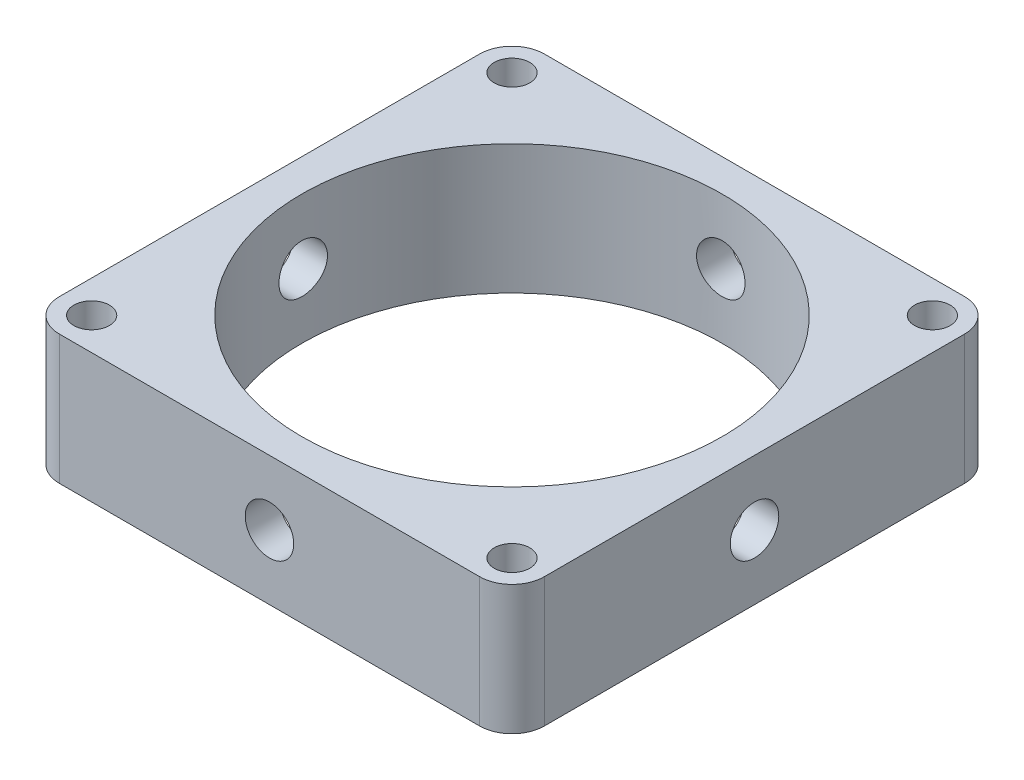
ISO-10303-21;
HEADER;
FILE_DESCRIPTION(('STEP AP214'),'2;1');
FILE_NAME('part.step','',(''),(''),'','','');
FILE_SCHEMA(('AUTOMOTIVE_DESIGN { 1 0 10303 214 1 1 1 1 }'));
ENDSEC;
DATA;
#1=APPLICATION_CONTEXT('core data for automotive mechanical design processes');
#2=APPLICATION_PROTOCOL_DEFINITION('international standard','automotive_design',2000,#1);
#3=PRODUCT_CONTEXT('',#1,'mechanical');
#4=PRODUCT('Part','Part','',(#3));
#5=PRODUCT_RELATED_PRODUCT_CATEGORY('part','',(#4));
#6=PRODUCT_DEFINITION_FORMATION('','',#4);
#7=PRODUCT_DEFINITION_CONTEXT('part definition',#1,'design');
#8=PRODUCT_DEFINITION('design','',#6,#7);
#9=PRODUCT_DEFINITION_SHAPE('','',#8);
#10=(LENGTH_UNIT() NAMED_UNIT(*) SI_UNIT(.MILLI.,.METRE.));
#11=(NAMED_UNIT(*) PLANE_ANGLE_UNIT() SI_UNIT($,.RADIAN.));
#12=(NAMED_UNIT(*) SI_UNIT($,.STERADIAN.) SOLID_ANGLE_UNIT());
#13=UNCERTAINTY_MEASURE_WITH_UNIT(LENGTH_MEASURE(1.E-05),#10,'distance_accuracy_value','');
#14=(GEOMETRIC_REPRESENTATION_CONTEXT(3) GLOBAL_UNCERTAINTY_ASSIGNED_CONTEXT((#13)) GLOBAL_UNIT_ASSIGNED_CONTEXT((#10,
#11,#12)) REPRESENTATION_CONTEXT('',''));
#15=CARTESIAN_POINT('',(0.,0.,0.));
#16=DIRECTION('',(0.,0.,1.));
#17=DIRECTION('',(1.,0.,0.));
#18=AXIS2_PLACEMENT_3D('',#15,#16,#17);
#19=CARTESIAN_POINT('',(0.,20.32,0.));
#20=DIRECTION('',(0.,-1.,0.));
#21=DIRECTION('',(0.,0.,-1.));
#22=AXIS2_PLACEMENT_3D('',#19,#20,#21);
#23=PLANE('',#22);
#24=DIRECTION('',(-1.,0.,0.));
#25=VECTOR('',#24,1.);
#26=CARTESIAN_POINT('',(-38.1,20.32,-38.1));
#27=LINE('',#26,#25);
#28=CARTESIAN_POINT('',(33.02,20.32,-38.1));
#29=VERTEX_POINT('',#28);
#30=CARTESIAN_POINT('',(-33.02,20.32,-38.1));
#31=VERTEX_POINT('',#30);
#32=EDGE_CURVE('E256',#29,#31,#27,.T.);
#33=ORIENTED_EDGE('',*,*,#32,.T.);
#34=CARTESIAN_POINT('',(-33.02,20.32,-33.02));
#35=DIRECTION('',(0.,-1.,0.));
#36=DIRECTION('',(0.,0.,-1.));
#37=AXIS2_PLACEMENT_3D('',#34,#35,#36);
#38=CIRCLE('',#37,5.08);
#39=CARTESIAN_POINT('',(-38.1,20.32,-33.02));
#40=VERTEX_POINT('',#39);
#41=EDGE_CURVE('E168',#31,#40,#38,.F.);
#42=ORIENTED_EDGE('',*,*,#41,.T.);
#43=DIRECTION('',(0.,0.,1.));
#44=VECTOR('',#43,1.);
#45=CARTESIAN_POINT('',(-38.1,20.32,38.1));
#46=LINE('',#45,#44);
#47=CARTESIAN_POINT('',(-38.1,20.32,33.02));
#48=VERTEX_POINT('',#47);
#49=EDGE_CURVE('E138',#40,#48,#46,.T.);
#50=ORIENTED_EDGE('',*,*,#49,.T.);
#51=CARTESIAN_POINT('',(-33.02,20.32,33.02));
#52=DIRECTION('',(0.,-1.,0.));
#53=DIRECTION('',(0.,0.,-1.));
#54=AXIS2_PLACEMENT_3D('',#51,#52,#53);
#55=CIRCLE('',#54,5.08);
#56=CARTESIAN_POINT('',(-33.02,20.32,38.1));
#57=VERTEX_POINT('',#56);
#58=EDGE_CURVE('E75',#48,#57,#55,.F.);
#59=ORIENTED_EDGE('',*,*,#58,.T.);
#60=DIRECTION('',(1.,0.,0.));
#61=VECTOR('',#60,1.);
#62=CARTESIAN_POINT('',(-38.1,20.32,38.1));
#63=LINE('',#62,#61);
#64=CARTESIAN_POINT('',(33.02,20.32,38.1));
#65=VERTEX_POINT('',#64);
#66=EDGE_CURVE('E154',#57,#65,#63,.T.);
#67=ORIENTED_EDGE('',*,*,#66,.T.);
#68=CARTESIAN_POINT('',(33.02,20.32,33.02));
#69=DIRECTION('',(0.,-1.,0.));
#70=DIRECTION('',(0.,0.,-1.));
#71=AXIS2_PLACEMENT_3D('',#68,#69,#70);
#72=CIRCLE('',#71,5.08);
#73=CARTESIAN_POINT('',(38.1,20.32,33.02));
#74=VERTEX_POINT('',#73);
#75=EDGE_CURVE('E163',#65,#74,#72,.F.);
#76=ORIENTED_EDGE('',*,*,#75,.T.);
#77=DIRECTION('',(0.,0.,-1.));
#78=VECTOR('',#77,1.);
#79=CARTESIAN_POINT('',(38.1,20.32,38.1));
#80=LINE('',#79,#78);
#81=CARTESIAN_POINT('',(38.1,20.32,-33.02));
#82=VERTEX_POINT('',#81);
#83=EDGE_CURVE('E148',#74,#82,#80,.T.);
#84=ORIENTED_EDGE('',*,*,#83,.T.);
#85=CARTESIAN_POINT('',(33.02,20.32,-33.02));
#86=DIRECTION('',(0.,-1.,0.));
#87=DIRECTION('',(0.,0.,-1.));
#88=AXIS2_PLACEMENT_3D('',#85,#86,#87);
#89=CIRCLE('',#88,5.08);
#90=EDGE_CURVE('E165',#82,#29,#89,.F.);
#91=ORIENTED_EDGE('',*,*,#90,.T.);
#92=EDGE_LOOP('',(#33,#42,#50,#59,#67,#76,#84,#91));
#93=FACE_BOUND('',#92,.T.);
#94=CARTESIAN_POINT('',(33.02,20.32,-33.02));
#95=DIRECTION('',(0.,1.,0.));
#96=DIRECTION('',(0.,0.,1.));
#97=AXIS2_PLACEMENT_3D('',#94,#95,#96);
#98=CIRCLE('',#97,2.794);
#99=CARTESIAN_POINT('',(33.02,20.32,-30.226));
#100=VERTEX_POINT('',#99);
#101=EDGE_CURVE('E249',#100,#100,#98,.T.);
#102=ORIENTED_EDGE('',*,*,#101,.F.);
#103=EDGE_LOOP('',(#102));
#104=FACE_BOUND('',#103,.T.);
#105=CARTESIAN_POINT('',(33.02,20.32,33.02));
#106=DIRECTION('',(0.,1.,0.));
#107=DIRECTION('',(0.,0.,1.));
#108=AXIS2_PLACEMENT_3D('',#105,#106,#107);
#109=CIRCLE('',#108,2.794);
#110=CARTESIAN_POINT('',(33.02,20.32,35.814));
#111=VERTEX_POINT('',#110);
#112=EDGE_CURVE('E243',#111,#111,#109,.T.);
#113=ORIENTED_EDGE('',*,*,#112,.F.);
#114=EDGE_LOOP('',(#113));
#115=FACE_BOUND('',#114,.T.);
#116=CARTESIAN_POINT('',(-33.02,20.32,33.02));
#117=DIRECTION('',(0.,1.,0.));
#118=DIRECTION('',(0.,0.,1.));
#119=AXIS2_PLACEMENT_3D('',#116,#117,#118);
#120=CIRCLE('',#119,2.794);
#121=CARTESIAN_POINT('',(-33.02,20.32,35.814));
#122=VERTEX_POINT('',#121);
#123=EDGE_CURVE('E237',#122,#122,#120,.T.);
#124=ORIENTED_EDGE('',*,*,#123,.F.);
#125=EDGE_LOOP('',(#124));
#126=FACE_BOUND('',#125,.T.);
#127=CARTESIAN_POINT('',(-33.02,20.32,-33.02));
#128=DIRECTION('',(0.,1.,0.));
#129=DIRECTION('',(0.,0.,1.));
#130=AXIS2_PLACEMENT_3D('',#127,#128,#129);
#131=CIRCLE('',#130,2.794);
#132=CARTESIAN_POINT('',(-33.02,20.32,-30.226));
#133=VERTEX_POINT('',#132);
#134=EDGE_CURVE('E231',#133,#133,#131,.T.);
#135=ORIENTED_EDGE('',*,*,#134,.F.);
#136=EDGE_LOOP('',(#135));
#137=FACE_BOUND('',#136,.T.);
#138=CARTESIAN_POINT('',(0.,20.32,0.));
#139=DIRECTION('',(0.,1.,0.));
#140=DIRECTION('',(0.,0.,1.));
#141=AXIS2_PLACEMENT_3D('',#138,#139,#140);
#142=CIRCLE('',#141,33.02);
#143=CARTESIAN_POINT('',(0.,20.32,33.02));
#144=VERTEX_POINT('',#143);
#145=EDGE_CURVE('E224',#144,#144,#142,.T.);
#146=ORIENTED_EDGE('',*,*,#145,.F.);
#147=EDGE_LOOP('',(#146));
#148=FACE_BOUND('',#147,.T.);
#149=ADVANCED_FACE('F46',(#93,#104,#115,#126,#137,#148),#23,.F.);
#150=CARTESIAN_POINT('',(0.,0.,0.));
#151=DIRECTION('',(0.,-1.,0.));
#152=DIRECTION('',(0.,0.,-1.));
#153=AXIS2_PLACEMENT_3D('',#150,#151,#152);
#154=PLANE('',#153);
#155=CARTESIAN_POINT('',(-33.02,0.,-33.02));
#156=DIRECTION('',(0.,1.,0.));
#157=DIRECTION('',(0.,0.,1.));
#158=AXIS2_PLACEMENT_3D('',#155,#156,#157);
#159=CIRCLE('',#158,2.794);
#160=CARTESIAN_POINT('',(-33.02,0.,-30.226));
#161=VERTEX_POINT('',#160);
#162=EDGE_CURVE('E227',#161,#161,#159,.T.);
#163=ORIENTED_EDGE('',*,*,#162,.T.);
#164=EDGE_LOOP('',(#163));
#165=FACE_BOUND('',#164,.T.);
#166=CARTESIAN_POINT('',(33.02,0.,33.02));
#167=DIRECTION('',(0.,1.,0.));
#168=DIRECTION('',(0.,0.,1.));
#169=AXIS2_PLACEMENT_3D('',#166,#167,#168);
#170=CIRCLE('',#169,2.794);
#171=CARTESIAN_POINT('',(33.02,0.,35.814));
#172=VERTEX_POINT('',#171);
#173=EDGE_CURVE('E240',#172,#172,#170,.T.);
#174=ORIENTED_EDGE('',*,*,#173,.T.);
#175=EDGE_LOOP('',(#174));
#176=FACE_BOUND('',#175,.T.);
#177=DIRECTION('',(0.,0.,1.));
#178=VECTOR('',#177,1.);
#179=CARTESIAN_POINT('',(-38.1,0.,38.1));
#180=LINE('',#179,#178);
#181=CARTESIAN_POINT('',(-38.1,0.,-33.02));
#182=VERTEX_POINT('',#181);
#183=CARTESIAN_POINT('',(-38.1,0.,33.02));
#184=VERTEX_POINT('',#183);
#185=EDGE_CURVE('E136',#182,#184,#180,.T.);
#186=ORIENTED_EDGE('',*,*,#185,.F.);
#187=CARTESIAN_POINT('',(-33.02,0.,-33.02));
#188=DIRECTION('',(0.,-1.,0.));
#189=DIRECTION('',(0.,0.,-1.));
#190=AXIS2_PLACEMENT_3D('',#187,#188,#189);
#191=CIRCLE('',#190,5.08);
#192=CARTESIAN_POINT('',(-33.02,0.,-38.1));
#193=VERTEX_POINT('',#192);
#194=EDGE_CURVE('E119',#182,#193,#191,.T.);
#195=ORIENTED_EDGE('',*,*,#194,.T.);
#196=DIRECTION('',(-1.,0.,0.));
#197=VECTOR('',#196,1.);
#198=CARTESIAN_POINT('',(-38.1,0.,-38.1));
#199=LINE('',#198,#197);
#200=CARTESIAN_POINT('',(33.02,0.,-38.1));
#201=VERTEX_POINT('',#200);
#202=EDGE_CURVE('E146',#201,#193,#199,.T.);
#203=ORIENTED_EDGE('',*,*,#202,.F.);
#204=CARTESIAN_POINT('',(33.02,0.,-33.02));
#205=DIRECTION('',(0.,-1.,0.));
#206=DIRECTION('',(0.,0.,-1.));
#207=AXIS2_PLACEMENT_3D('',#204,#205,#206);
#208=CIRCLE('',#207,5.08);
#209=CARTESIAN_POINT('',(38.1,0.,-33.02));
#210=VERTEX_POINT('',#209);
#211=EDGE_CURVE('E157',#201,#210,#208,.T.);
#212=ORIENTED_EDGE('',*,*,#211,.T.);
#213=DIRECTION('',(0.,0.,-1.));
#214=VECTOR('',#213,1.);
#215=CARTESIAN_POINT('',(38.1,0.,38.1));
#216=LINE('',#215,#214);
#217=CARTESIAN_POINT('',(38.1,0.,33.02));
#218=VERTEX_POINT('',#217);
#219=EDGE_CURVE('E150',#218,#210,#216,.T.);
#220=ORIENTED_EDGE('',*,*,#219,.F.);
#221=CARTESIAN_POINT('',(33.02,0.,33.02));
#222=DIRECTION('',(0.,-1.,0.));
#223=DIRECTION('',(0.,0.,-1.));
#224=AXIS2_PLACEMENT_3D('',#221,#222,#223);
#225=CIRCLE('',#224,5.08);
#226=CARTESIAN_POINT('',(33.02,0.,38.1));
#227=VERTEX_POINT('',#226);
#228=EDGE_CURVE('E139',#218,#227,#225,.T.);
#229=ORIENTED_EDGE('',*,*,#228,.T.);
#230=DIRECTION('',(1.,0.,0.));
#231=VECTOR('',#230,1.);
#232=CARTESIAN_POINT('',(-38.1,0.,38.1));
#233=LINE('',#232,#231);
#234=CARTESIAN_POINT('',(-33.02,0.,38.1));
#235=VERTEX_POINT('',#234);
#236=EDGE_CURVE('E145',#235,#227,#233,.T.);
#237=ORIENTED_EDGE('',*,*,#236,.F.);
#238=CARTESIAN_POINT('',(-33.02,0.,33.02));
#239=DIRECTION('',(0.,-1.,0.));
#240=DIRECTION('',(0.,0.,-1.));
#241=AXIS2_PLACEMENT_3D('',#238,#239,#240);
#242=CIRCLE('',#241,5.08);
#243=EDGE_CURVE('E130',#235,#184,#242,.T.);
#244=ORIENTED_EDGE('',*,*,#243,.T.);
#245=EDGE_LOOP('',(#186,#195,#203,#212,#220,#229,#237,#244));
#246=FACE_BOUND('',#245,.T.);
#247=CARTESIAN_POINT('',(33.02,0.,-33.02));
#248=DIRECTION('',(0.,1.,0.));
#249=DIRECTION('',(0.,0.,1.));
#250=AXIS2_PLACEMENT_3D('',#247,#248,#249);
#251=CIRCLE('',#250,2.794);
#252=CARTESIAN_POINT('',(33.02,0.,-30.226));
#253=VERTEX_POINT('',#252);
#254=EDGE_CURVE('E246',#253,#253,#251,.T.);
#255=ORIENTED_EDGE('',*,*,#254,.T.);
#256=EDGE_LOOP('',(#255));
#257=FACE_BOUND('',#256,.T.);
#258=CARTESIAN_POINT('',(-33.02,0.,33.02));
#259=DIRECTION('',(0.,1.,0.));
#260=DIRECTION('',(0.,0.,1.));
#261=AXIS2_PLACEMENT_3D('',#258,#259,#260);
#262=CIRCLE('',#261,2.794);
#263=CARTESIAN_POINT('',(-33.02,0.,35.814));
#264=VERTEX_POINT('',#263);
#265=EDGE_CURVE('E234',#264,#264,#262,.T.);
#266=ORIENTED_EDGE('',*,*,#265,.T.);
#267=EDGE_LOOP('',(#266));
#268=FACE_BOUND('',#267,.T.);
#269=CARTESIAN_POINT('',(0.,0.,0.));
#270=DIRECTION('',(0.,1.,0.));
#271=DIRECTION('',(0.,0.,1.));
#272=AXIS2_PLACEMENT_3D('',#269,#270,#271);
#273=CIRCLE('',#272,33.02);
#274=CARTESIAN_POINT('',(0.,0.,33.02));
#275=VERTEX_POINT('',#274);
#276=EDGE_CURVE('E228',#275,#275,#273,.T.);
#277=ORIENTED_EDGE('',*,*,#276,.T.);
#278=EDGE_LOOP('',(#277));
#279=FACE_BOUND('',#278,.T.);
#280=ADVANCED_FACE('F142',(#165,#176,#246,#257,#268,#279),#154,.T.);
#281=CARTESIAN_POINT('',(38.1,20.32,38.1));
#282=DIRECTION('',(-1.,0.,0.));
#283=DIRECTION('',(0.,0.,1.));
#284=AXIS2_PLACEMENT_3D('',#281,#282,#283);
#285=PLANE('',#284);
#286=CARTESIAN_POINT('',(38.1,10.16,0.));
#287=DIRECTION('',(1.,0.,0.));
#288=DIRECTION('',(0.,0.,-1.));
#289=AXIS2_PLACEMENT_3D('',#286,#287,#288);
#290=CIRCLE('',#289,3.81);
#291=CARTESIAN_POINT('',(38.1,10.16,-3.80999999999999));
#292=VERTEX_POINT('',#291);
#293=EDGE_CURVE('E213',#292,#292,#290,.T.);
#294=ORIENTED_EDGE('',*,*,#293,.F.);
#295=EDGE_LOOP('',(#294));
#296=FACE_BOUND('',#295,.T.);
#297=ORIENTED_EDGE('',*,*,#219,.T.);
#298=DIRECTION('',(0.,-1.,0.));
#299=VECTOR('',#298,1.);
#300=CARTESIAN_POINT('',(38.1,20.32,-33.02));
#301=LINE('',#300,#299);
#302=EDGE_CURVE('E12',#210,#82,#301,.F.);
#303=ORIENTED_EDGE('',*,*,#302,.T.);
#304=ORIENTED_EDGE('',*,*,#83,.F.);
#305=DIRECTION('',(0.,-1.,0.));
#306=VECTOR('',#305,1.);
#307=CARTESIAN_POINT('',(38.1,20.32,33.02));
#308=LINE('',#307,#306);
#309=EDGE_CURVE('E60',#74,#218,#308,.T.);
#310=ORIENTED_EDGE('',*,*,#309,.T.);
#311=EDGE_LOOP('',(#297,#303,#304,#310));
#312=FACE_BOUND('',#311,.T.);
#313=ADVANCED_FACE('F264',(#296,#312),#285,.F.);
#314=CARTESIAN_POINT('',(-38.1,20.32,-38.1));
#315=DIRECTION('',(0.,0.,1.));
#316=DIRECTION('',(1.,0.,0.));
#317=AXIS2_PLACEMENT_3D('',#314,#315,#316);
#318=PLANE('',#317);
#319=CARTESIAN_POINT('',(0.,10.16,-38.1));
#320=DIRECTION('',(0.,0.,1.));
#321=DIRECTION('',(1.,0.,0.));
#322=AXIS2_PLACEMENT_3D('',#319,#320,#321);
#323=CIRCLE('',#322,3.81);
#324=CARTESIAN_POINT('',(3.81,10.16,-38.1));
#325=VERTEX_POINT('',#324);
#326=EDGE_CURVE('E184',#325,#325,#323,.T.);
#327=ORIENTED_EDGE('',*,*,#326,.T.);
#328=EDGE_LOOP('',(#327));
#329=FACE_BOUND('',#328,.T.);
#330=ORIENTED_EDGE('',*,*,#202,.T.);
#331=DIRECTION('',(0.,-1.,0.));
#332=VECTOR('',#331,1.);
#333=CARTESIAN_POINT('',(-33.02,20.32,-38.1));
#334=LINE('',#333,#332);
#335=EDGE_CURVE('E124',#193,#31,#334,.F.);
#336=ORIENTED_EDGE('',*,*,#335,.T.);
#337=ORIENTED_EDGE('',*,*,#32,.F.);
#338=DIRECTION('',(0.,-1.,0.));
#339=VECTOR('',#338,1.);
#340=CARTESIAN_POINT('',(33.02,20.32,-38.1));
#341=LINE('',#340,#339);
#342=EDGE_CURVE('E129',#29,#201,#341,.T.);
#343=ORIENTED_EDGE('',*,*,#342,.T.);
#344=EDGE_LOOP('',(#330,#336,#337,#343));
#345=FACE_BOUND('',#344,.T.);
#346=ADVANCED_FACE('F274',(#329,#345),#318,.F.);
#347=CARTESIAN_POINT('',(-38.1,20.32,38.1));
#348=DIRECTION('',(1.,0.,0.));
#349=DIRECTION('',(0.,0.,-1.));
#350=AXIS2_PLACEMENT_3D('',#347,#348,#349);
#351=PLANE('',#350);
#352=CARTESIAN_POINT('',(-38.1,10.16,0.));
#353=DIRECTION('',(1.,0.,0.));
#354=DIRECTION('',(0.,0.,-1.));
#355=AXIS2_PLACEMENT_3D('',#352,#353,#354);
#356=CIRCLE('',#355,3.81);
#357=CARTESIAN_POINT('',(-38.1,10.16,-3.80999999999999));
#358=VERTEX_POINT('',#357);
#359=EDGE_CURVE('E208',#358,#358,#356,.T.);
#360=ORIENTED_EDGE('',*,*,#359,.T.);
#361=EDGE_LOOP('',(#360));
#362=FACE_BOUND('',#361,.T.);
#363=ORIENTED_EDGE('',*,*,#49,.F.);
#364=DIRECTION('',(0.,-1.,0.));
#365=VECTOR('',#364,1.);
#366=CARTESIAN_POINT('',(-38.1,20.32,-33.02));
#367=LINE('',#366,#365);
#368=EDGE_CURVE('E123',#40,#182,#367,.T.);
#369=ORIENTED_EDGE('',*,*,#368,.T.);
#370=ORIENTED_EDGE('',*,*,#185,.T.);
#371=DIRECTION('',(0.,-1.,0.));
#372=VECTOR('',#371,1.);
#373=CARTESIAN_POINT('',(-38.1,20.32,33.02));
#374=LINE('',#373,#372);
#375=EDGE_CURVE('E140',#184,#48,#374,.F.);
#376=ORIENTED_EDGE('',*,*,#375,.T.);
#377=EDGE_LOOP('',(#363,#369,#370,#376));
#378=FACE_BOUND('',#377,.T.);
#379=ADVANCED_FACE('F135',(#362,#378),#351,.F.);
#380=CARTESIAN_POINT('',(-38.1,20.32,38.1));
#381=DIRECTION('',(0.,0.,-1.));
#382=DIRECTION('',(-1.,0.,0.));
#383=AXIS2_PLACEMENT_3D('',#380,#381,#382);
#384=PLANE('',#383);
#385=CARTESIAN_POINT('',(0.,10.16,38.1));
#386=DIRECTION('',(0.,0.,1.));
#387=DIRECTION('',(1.,0.,0.));
#388=AXIS2_PLACEMENT_3D('',#385,#386,#387);
#389=CIRCLE('',#388,3.81);
#390=CARTESIAN_POINT('',(3.81,10.16,38.1));
#391=VERTEX_POINT('',#390);
#392=EDGE_CURVE('E211',#391,#391,#389,.T.);
#393=ORIENTED_EDGE('',*,*,#392,.F.);
#394=EDGE_LOOP('',(#393));
#395=FACE_BOUND('',#394,.T.);
#396=ORIENTED_EDGE('',*,*,#66,.F.);
#397=DIRECTION('',(0.,-1.,0.));
#398=VECTOR('',#397,1.);
#399=CARTESIAN_POINT('',(-33.02,20.32,38.1));
#400=LINE('',#399,#398);
#401=EDGE_CURVE('E171',#57,#235,#400,.T.);
#402=ORIENTED_EDGE('',*,*,#401,.T.);
#403=ORIENTED_EDGE('',*,*,#236,.T.);
#404=DIRECTION('',(0.,-1.,0.));
#405=VECTOR('',#404,1.);
#406=CARTESIAN_POINT('',(33.02,20.32,38.1));
#407=LINE('',#406,#405);
#408=EDGE_CURVE('E68',#227,#65,#407,.F.);
#409=ORIENTED_EDGE('',*,*,#408,.T.);
#410=EDGE_LOOP('',(#396,#402,#403,#409));
#411=FACE_BOUND('',#410,.T.);
#412=ADVANCED_FACE('F282',(#395,#411),#384,.F.);
#413=CARTESIAN_POINT('',(33.02,20.32,-33.02));
#414=DIRECTION('',(0.,-1.,0.));
#415=DIRECTION('',(0.,0.,-1.));
#416=AXIS2_PLACEMENT_3D('',#413,#414,#415);
#417=CYLINDRICAL_SURFACE('',#416,2.794);
#418=ORIENTED_EDGE('',*,*,#101,.T.);
#419=EDGE_LOOP('',(#418));
#420=FACE_BOUND('',#419,.T.);
#421=ORIENTED_EDGE('',*,*,#254,.F.);
#422=EDGE_LOOP('',(#421));
#423=FACE_BOUND('',#422,.T.);
#424=ADVANCED_FACE('F294',(#420,#423),#417,.F.);
#425=CARTESIAN_POINT('',(33.02,20.32,33.02));
#426=DIRECTION('',(0.,-1.,0.));
#427=DIRECTION('',(0.,0.,-1.));
#428=AXIS2_PLACEMENT_3D('',#425,#426,#427);
#429=CYLINDRICAL_SURFACE('',#428,2.794);
#430=ORIENTED_EDGE('',*,*,#112,.T.);
#431=EDGE_LOOP('',(#430));
#432=FACE_BOUND('',#431,.T.);
#433=ORIENTED_EDGE('',*,*,#173,.F.);
#434=EDGE_LOOP('',(#433));
#435=FACE_BOUND('',#434,.T.);
#436=ADVANCED_FACE('F302',(#432,#435),#429,.F.);
#437=CARTESIAN_POINT('',(-33.02,20.32,33.02));
#438=DIRECTION('',(0.,-1.,0.));
#439=DIRECTION('',(0.,0.,-1.));
#440=AXIS2_PLACEMENT_3D('',#437,#438,#439);
#441=CYLINDRICAL_SURFACE('',#440,2.794);
#442=ORIENTED_EDGE('',*,*,#123,.T.);
#443=EDGE_LOOP('',(#442));
#444=FACE_BOUND('',#443,.T.);
#445=ORIENTED_EDGE('',*,*,#265,.F.);
#446=EDGE_LOOP('',(#445));
#447=FACE_BOUND('',#446,.T.);
#448=ADVANCED_FACE('F324',(#444,#447),#441,.F.);
#449=CARTESIAN_POINT('',(-33.02,20.32,-33.02));
#450=DIRECTION('',(0.,-1.,0.));
#451=DIRECTION('',(0.,0.,-1.));
#452=AXIS2_PLACEMENT_3D('',#449,#450,#451);
#453=CYLINDRICAL_SURFACE('',#452,2.794);
#454=ORIENTED_EDGE('',*,*,#134,.T.);
#455=EDGE_LOOP('',(#454));
#456=FACE_BOUND('',#455,.T.);
#457=ORIENTED_EDGE('',*,*,#162,.F.);
#458=EDGE_LOOP('',(#457));
#459=FACE_BOUND('',#458,.T.);
#460=ADVANCED_FACE('F319',(#456,#459),#453,.F.);
#461=CARTESIAN_POINT('',(0.,20.32,0.));
#462=DIRECTION('',(0.,-1.,0.));
#463=DIRECTION('',(0.,0.,-1.));
#464=AXIS2_PLACEMENT_3D('',#461,#462,#463);
#465=CYLINDRICAL_SURFACE('',#464,33.02);
#466=CARTESIAN_POINT('',(-32.7994557881682,10.16,-3.80999999999999));
#467=CARTESIAN_POINT('',(-32.7994586404039,10.3732437119522,-3.8099908593245));
#468=CARTESIAN_POINT('',(-32.8015578109357,10.5866238779125,-3.79203692789409));
#469=CARTESIAN_POINT('',(-32.8097253401963,11.0074550039894,-3.72069381093511));
#470=CARTESIAN_POINT('',(-32.8157979395227,11.2148993820483,-3.66726676622508));
#471=CARTESIAN_POINT('',(-32.8312155366084,11.6177045137935,-3.52656543248153));
#472=CARTESIAN_POINT('',(-32.8405584104652,11.8130730135821,-3.43931310756727));
#473=CARTESIAN_POINT('',(-32.8614612731401,12.1863549960965,-3.23348312187128));
#474=CARTESIAN_POINT('',(-32.8730208577321,12.3642716523105,-3.11491117086625));
#475=CARTESIAN_POINT('',(-32.8971166937691,12.6984906721543,-2.84919868205245));
#476=CARTESIAN_POINT('',(-32.9096569071427,12.854697437531,-2.701938245288));
#477=CARTESIAN_POINT('',(-32.9342652840457,13.140237759307,-2.38328648051506));
#478=CARTESIAN_POINT('',(-32.9463334248575,13.2695700237017,-2.21189399301082));
#479=CARTESIAN_POINT('',(-32.9686779684029,13.4980285481032,-1.84924784158318));
#480=CARTESIAN_POINT('',(-32.978949244815,13.5970689704589,-1.65793975923508));
#481=CARTESIAN_POINT('',(-32.9964993733262,13.7615829141723,-1.26126897725749));
#482=CARTESIAN_POINT('',(-33.0037783207811,13.8270575051798,-1.05590672573179));
#483=CARTESIAN_POINT('',(-33.0144957790835,13.9222974450093,-0.637930913199274));
#484=CARTESIAN_POINT('',(-33.0179513101135,13.9522210953957,-0.425353866150141));
#485=CARTESIAN_POINT('',(-33.020690623193,13.9760000104006,0.00183101492354966));
#486=CARTESIAN_POINT('',(-33.0199745464207,13.9698564956264,0.216438779977888));
#487=CARTESIAN_POINT('',(-33.0144651605986,13.9218030038566,0.640517129298284));
#488=CARTESIAN_POINT('',(-33.0096912581114,13.8800632627731,0.850007290946884));
#489=CARTESIAN_POINT('',(-32.9966246035693,13.7622678978412,1.25898924161923));
#490=CARTESIAN_POINT('',(-32.9883317931208,13.6862117045362,1.45848086466339));
#491=CARTESIAN_POINT('',(-32.9691258785628,13.5017590561672,1.84233386483144));
#492=CARTESIAN_POINT('',(-32.958206761696,13.3932882497709,2.02665920090187));
#493=CARTESIAN_POINT('',(-32.9349713484448,13.1471395034327,2.37455410538881));
#494=CARTESIAN_POINT('',(-32.9226549974559,13.0094604218361,2.53812286209981));
#495=CARTESIAN_POINT('',(-32.8979203609248,12.7078482260071,2.84086039450935));
#496=CARTESIAN_POINT('',(-32.885501899508,12.5437668578525,2.97988149489635));
#497=CARTESIAN_POINT('',(-32.8620337934598,12.1945189701417,3.22843150801743));
#498=CARTESIAN_POINT('',(-32.8509841520563,12.0093524008655,3.33796035120524));
#499=CARTESIAN_POINT('',(-32.8315045097232,11.6230661683498,3.5244213946337));
#500=CARTESIAN_POINT('',(-32.8230753701992,11.4219412865416,3.60134287926928));
#501=CARTESIAN_POINT('',(-32.8098083890365,11.0095109334294,3.72028054201731));
#502=CARTESIAN_POINT('',(-32.8049704006792,10.798205878418,3.76229814615676));
#503=CARTESIAN_POINT('',(-32.7994598132466,10.3727143911714,3.81004206047484));
#504=CARTESIAN_POINT('',(-32.7987634192323,10.1585515181776,3.81597569042462));
#505=CARTESIAN_POINT('',(-32.8015520019406,9.73228270218688,3.79192919420943));
#506=CARTESIAN_POINT('',(-32.8050369030109,9.52017672204454,3.76194971782153));
#507=CARTESIAN_POINT('',(-32.8157737356479,9.10465689964272,3.66710212615249));
#508=CARTESIAN_POINT('',(-32.8230149307278,8.90122006267852,3.60233342910431));
#509=CARTESIAN_POINT('',(-32.840439758629,8.50809587925372,3.43984793140624));
#510=CARTESIAN_POINT('',(-32.850623480229,8.31840894785659,3.34213013663655));
#511=CARTESIAN_POINT('',(-32.8728431775773,7.95722823227967,3.11600661505779));
#512=CARTESIAN_POINT('',(-32.8848873073568,7.78582044228313,2.98746434622634));
#513=CARTESIAN_POINT('',(-32.9094447307295,7.46693885775069,2.70353483570937));
#514=CARTESIAN_POINT('',(-32.9219580398193,7.3194658546201,2.54814670671428));
#515=CARTESIAN_POINT('',(-32.946116488079,7.05191725408135,2.21403326856856));
#516=CARTESIAN_POINT('',(-32.9577571400483,6.93197748533731,2.03519882131621));
#517=CARTESIAN_POINT('',(-32.9787923530155,6.72383771571531,1.65980333911183));
#518=CARTESIAN_POINT('',(-32.9881869534626,6.6356371573626,1.46324261558402));
#519=CARTESIAN_POINT('',(-33.003651503614,6.49370620932676,1.0584348894959));
#520=CARTESIAN_POINT('',(-33.0097291593207,6.43989587326867,0.850216223671953));
#521=CARTESIAN_POINT('',(-33.0179068879971,6.36801240783274,0.427624927313243));
#522=CARTESIAN_POINT('',(-33.0200071125001,6.34993791697764,0.213252531541225));
#523=CARTESIAN_POINT('',(-33.0199928914686,6.35006204606478,-0.21423154109171));
#524=CARTESIAN_POINT('',(-33.0179028480914,6.36805065139644,-0.42734331051435));
#525=CARTESIAN_POINT('',(-33.0097912566222,6.43934735038118,-0.847494411044976));
#526=CARTESIAN_POINT('',(-33.0037697086183,6.49265544324042,-1.05453374228945));
#527=CARTESIAN_POINT('',(-32.9884690562389,6.63301503866494,-1.45664581851828));
#528=CARTESIAN_POINT('',(-32.97919077133,6.72005805335414,-1.65172155931373));
#529=CARTESIAN_POINT('',(-32.9584068433954,6.92539483234565,-2.02452935962779));
#530=CARTESIAN_POINT('',(-32.9469011899124,7.04368874336859,-2.20226133771336));
#531=CARTESIAN_POINT('',(-32.9228686882262,7.30895138799023,-2.53641122142363));
#532=CARTESIAN_POINT('',(-32.9103364955639,7.45607657981043,-2.69270454478969));
#533=CARTESIAN_POINT('',(-32.8857073081137,7.7745049677289,-2.97846992048102));
#534=CARTESIAN_POINT('',(-32.8736104176147,7.94581390996514,-3.10793558037166));
#535=CARTESIAN_POINT('',(-32.8511788279347,8.30838708499326,-3.33672725468297));
#536=CARTESIAN_POINT('',(-32.8408500879883,8.4997154300497,-3.43595219197334));
#537=CARTESIAN_POINT('',(-32.823194414343,8.89632480308022,-3.60072738339063));
#538=CARTESIAN_POINT('',(-32.8158641677865,9.10159013883142,-3.66631482204671));
#539=CARTESIAN_POINT('',(-32.8068436967581,9.44996694838071,-3.74598109964888));
#540=CARTESIAN_POINT('',(-32.804086739609,9.59086797075654,-3.7699543768182));
#541=CARTESIAN_POINT('',(-32.8003918359511,9.87449227680951,-3.80196683867022));
#542=CARTESIAN_POINT('',(-32.7994538783586,10.0172155493777,-3.81000612044461));
#543=CARTESIAN_POINT('',(-32.7994557881682,10.16,-3.80999999999999));
#544=B_SPLINE_CURVE_WITH_KNOTS('',3,(#466,#467,#468,#469,#470,#471,#472,#473,#474,#475,#476,
#477,#478,#479,#480,#481,#482,#483,#484,#485,#486,#487,#488,#489,#490,#491,#492,#493,#494,#495,
#496,#497,#498,#499,#500,#501,#502,#503,#504,#505,#506,#507,#508,#509,#510,#511,#512,#513,#514,
#515,#516,#517,#518,#519,#520,#521,#522,#523,#524,#525,#526,#527,#528,#529,#530,#531,#532,#533,
#534,#535,#536,#537,#538,#539,#540,#541,#542,#543),.UNSPECIFIED.,.T.,.F.,(4,2,2,2,2,2,2,2,2,2,2,
2,2,2,2,2,2,2,2,2,2,2,2,2,2,2,2,2,2,2,2,2,2,2,2,2,2,2,4),(0.,0.639209602225754,1.27910250889604,
1.91858060137498,2.55794219309981,3.2000355526196,3.84215977394844,4.48608706812347,
5.12999384084705,5.77102254291239,6.41202955101296,7.04998807911279,7.6879571940645,
8.32740103820759,8.96686988070077,9.61006351815672,10.2532586723272,10.896665033185,
11.5400451058492,12.1797251315204,12.8193935836137,13.4572436860191,14.0951130349653,
14.7358618933812,15.3766319338865,16.0204982011706,16.6643531588881,17.3067058605016,
17.9490340890563,18.5876325642623,19.2262310251151,19.8646689155813,20.5031098035193,
21.1451163648576,21.7872757265992,22.4315584908634,23.0751274900626,23.5031342396759,
23.9311383812788),.UNSPECIFIED.);
#545=CARTESIAN_POINT('',(-32.7994557881682,10.16,-3.80999999999999));
#546=VERTEX_POINT('',#545);
#547=EDGE_CURVE('E50',#546,#546,#544,.T.);
#548=ORIENTED_EDGE('',*,*,#547,.F.);
#549=EDGE_LOOP('',(#548));
#550=FACE_BOUND('',#549,.T.);
#551=CARTESIAN_POINT('',(32.7994557881682,10.16,-3.80999999999999));
#552=CARTESIAN_POINT('',(32.7994586404038,9.94675628804784,-3.8099908593245));
#553=CARTESIAN_POINT('',(32.8015578109356,9.73337612208747,-3.79203692789409));
#554=CARTESIAN_POINT('',(32.8097253401963,9.31254499601064,-3.72069381093511));
#555=CARTESIAN_POINT('',(32.8157979395226,9.10510061795168,-3.66726676622508));
#556=CARTESIAN_POINT('',(32.8312155366084,8.70229548620648,-3.52656543248153));
#557=CARTESIAN_POINT('',(32.8405584104651,8.50692698641794,-3.43931310756727));
#558=CARTESIAN_POINT('',(32.8614612731401,8.13364500390349,-3.23348312187128));
#559=CARTESIAN_POINT('',(32.8730208577321,7.9557283476895,-3.11491117086625));
#560=CARTESIAN_POINT('',(32.8971166937691,7.62150932784572,-2.84919868205245));
#561=CARTESIAN_POINT('',(32.9096569071426,7.46530256246896,-2.70193824528801));
#562=CARTESIAN_POINT('',(32.9342652840457,7.17976224069298,-2.38328648051506));
#563=CARTESIAN_POINT('',(32.9463334248574,7.05042997629832,-2.21189399301082));
#564=CARTESIAN_POINT('',(32.9686779684028,6.8219714518968,-1.84924784158319));
#565=CARTESIAN_POINT('',(32.978949244815,6.72293102954108,-1.65793975923508));
#566=CARTESIAN_POINT('',(32.9964993733262,6.55841708582772,-1.26126897725749));
#567=CARTESIAN_POINT('',(33.003778320781,6.49294249482019,-1.0559067257318));
#568=CARTESIAN_POINT('',(33.0144957790834,6.39770255499071,-0.637930913199279));
#569=CARTESIAN_POINT('',(33.0179513101134,6.36777890460429,-0.425353866150145));
#570=CARTESIAN_POINT('',(33.0206906231929,6.34399998959938,0.00183101492354565));
#571=CARTESIAN_POINT('',(33.0199745464206,6.35014350437358,0.216438779977884));
#572=CARTESIAN_POINT('',(33.0144651605986,6.39819699614335,0.64051712929828));
#573=CARTESIAN_POINT('',(33.0096912581114,6.43993673722695,0.85000729094688));
#574=CARTESIAN_POINT('',(32.9966246035693,6.55773210215876,1.25898924161923));
#575=CARTESIAN_POINT('',(32.9883317931208,6.6337882954638,1.45848086466338));
#576=CARTESIAN_POINT('',(32.9691258785628,6.81824094383275,1.84233386483144));
#577=CARTESIAN_POINT('',(32.958206761696,6.92671175022913,2.02665920090187));
#578=CARTESIAN_POINT('',(32.9349713484447,7.1728604965673,2.37455410538881));
#579=CARTESIAN_POINT('',(32.9226549974559,7.31053957816391,2.53812286209981));
#580=CARTESIAN_POINT('',(32.8979203609247,7.61215177399286,2.84086039450935));
#581=CARTESIAN_POINT('',(32.8855018995079,7.7762331421475,2.97988149489635));
#582=CARTESIAN_POINT('',(32.8620337934597,8.12548102985832,3.22843150801743));
#583=CARTESIAN_POINT('',(32.8509841520562,8.31064759913447,3.33796035120524));
#584=CARTESIAN_POINT('',(32.8315045097231,8.69693383165017,3.5244213946337));
#585=CARTESIAN_POINT('',(32.8230753701992,8.89805871345835,3.60134287926928));
#586=CARTESIAN_POINT('',(32.8098083890365,9.31048906657057,3.72028054201731));
#587=CARTESIAN_POINT('',(32.8049704006791,9.52179412158198,3.76229814615676));
#588=CARTESIAN_POINT('',(32.7994598132465,9.94728560882861,3.81004206047484));
#589=CARTESIAN_POINT('',(32.7987634192322,10.1614484818224,3.81597569042462));
#590=CARTESIAN_POINT('',(32.8015520019406,10.5877172978131,3.79192919420943));
#591=CARTESIAN_POINT('',(32.8050369030108,10.7998232779555,3.76194971782153));
#592=CARTESIAN_POINT('',(32.8157737356478,11.2153431003573,3.66710212615249));
#593=CARTESIAN_POINT('',(32.8230149307278,11.4187799373215,3.60233342910431));
#594=CARTESIAN_POINT('',(32.840439758629,11.8119041207463,3.43984793140624));
#595=CARTESIAN_POINT('',(32.850623480229,12.0015910521434,3.34213013663656));
#596=CARTESIAN_POINT('',(32.8728431775772,12.3627717677203,3.11600661505779));
#597=CARTESIAN_POINT('',(32.8848873073567,12.5341795577169,2.98746434622634));
#598=CARTESIAN_POINT('',(32.9094447307294,12.8530611422493,2.70353483570938));
#599=CARTESIAN_POINT('',(32.9219580398192,13.0005341453799,2.54814670671428));
#600=CARTESIAN_POINT('',(32.946116488079,13.2680827459186,2.21403326856857));
#601=CARTESIAN_POINT('',(32.9577571400483,13.3880225146627,2.03519882131621));
#602=CARTESIAN_POINT('',(32.9787923530154,13.5961622842847,1.65980333911183));
#603=CARTESIAN_POINT('',(32.9881869534625,13.6843628426374,1.46324261558403));
#604=CARTESIAN_POINT('',(33.0036515036139,13.8262937906732,1.0584348894959));
#605=CARTESIAN_POINT('',(33.0097291593207,13.8801041267313,0.850216223671955));
#606=CARTESIAN_POINT('',(33.017906887997,13.9519875921673,0.427624927313246));
#607=CARTESIAN_POINT('',(33.0200071125001,13.9700620830224,0.213252531541228));
#608=CARTESIAN_POINT('',(33.0199928914685,13.9699379539352,-0.214231541091706));
#609=CARTESIAN_POINT('',(33.0179028480914,13.9519493486036,-0.427343310514347));
#610=CARTESIAN_POINT('',(33.0097912566221,13.8806526496188,-0.847494411044974));
#611=CARTESIAN_POINT('',(33.0037697086183,13.8273445567596,-1.05453374228945));
#612=CARTESIAN_POINT('',(32.9884690562388,13.6869849613351,-1.45664581851828));
#613=CARTESIAN_POINT('',(32.97919077133,13.5999419466459,-1.65172155931373));
#614=CARTESIAN_POINT('',(32.9584068433954,13.3946051676544,-2.02452935962779));
#615=CARTESIAN_POINT('',(32.9469011899124,13.2763112566314,-2.20226133771335));
#616=CARTESIAN_POINT('',(32.9228686882262,13.0110486120098,-2.53641122142363));
#617=CARTESIAN_POINT('',(32.9103364955639,12.8639234201896,-2.69270454478968));
#618=CARTESIAN_POINT('',(32.8857073081137,12.5454950322711,-2.97846992048102));
#619=CARTESIAN_POINT('',(32.8736104176147,12.3741860900349,-3.10793558037166));
#620=CARTESIAN_POINT('',(32.8511788279347,12.0116129150067,-3.33672725468297));
#621=CARTESIAN_POINT('',(32.8408500879882,11.8202845699503,-3.43595219197334));
#622=CARTESIAN_POINT('',(32.8231944143429,11.4236751969198,-3.60072738339063));
#623=CARTESIAN_POINT('',(32.8158641677864,11.2184098611686,-3.66631482204671));
#624=CARTESIAN_POINT('',(32.806843696758,10.8700330516193,-3.74598109964888));
#625=CARTESIAN_POINT('',(32.8040867396089,10.7291320292435,-3.7699543768182));
#626=CARTESIAN_POINT('',(32.8003918359511,10.4455077231905,-3.80196683867022));
#627=CARTESIAN_POINT('',(32.7994538783585,10.3027844506223,-3.81000612044461));
#628=CARTESIAN_POINT('',(32.7994557881682,10.16,-3.80999999999999));
#629=B_SPLINE_CURVE_WITH_KNOTS('',3,(#551,#552,#553,#554,#555,#556,#557,#558,#559,#560,#561,
#562,#563,#564,#565,#566,#567,#568,#569,#570,#571,#572,#573,#574,#575,#576,#577,#578,#579,#580,
#581,#582,#583,#584,#585,#586,#587,#588,#589,#590,#591,#592,#593,#594,#595,#596,#597,#598,#599,
#600,#601,#602,#603,#604,#605,#606,#607,#608,#609,#610,#611,#612,#613,#614,#615,#616,#617,#618,
#619,#620,#621,#622,#623,#624,#625,#626,#627,#628),.UNSPECIFIED.,.T.,.F.,(4,2,2,2,2,2,2,2,2,2,2,
2,2,2,2,2,2,2,2,2,2,2,2,2,2,2,2,2,2,2,2,2,2,2,2,2,2,2,4),(0.,0.639209602225751,1.27910250889604,
1.91858060137497,2.55794219309981,3.2000355526196,3.84215977394844,4.48608706812347,
5.12999384084705,5.77102254291238,6.41202955101296,7.04998807911279,7.6879571940645,
8.32740103820758,8.96686988070077,9.61006351815672,10.2532586723272,10.896665033185,
11.5400451058492,12.1797251315204,12.8193935836137,13.4572436860191,14.0951130349653,
14.7358618933812,15.3766319338865,16.0204982011706,16.6643531588881,17.3067058605016,
17.9490340890563,18.5876325642624,19.2262310251151,19.8646689155813,20.5031098035193,
21.1451163648576,21.7872757265992,22.4315584908634,23.0751274900626,23.5031342396759,
23.9311383812788),.UNSPECIFIED.);
#630=CARTESIAN_POINT('',(32.7994557881682,10.16,-3.80999999999999));
#631=VERTEX_POINT('',#630);
#632=EDGE_CURVE('E203',#631,#631,#629,.T.);
#633=ORIENTED_EDGE('',*,*,#632,.F.);
#634=EDGE_LOOP('',(#633));
#635=FACE_BOUND('',#634,.T.);
#636=CARTESIAN_POINT('',(0.,13.97,-33.02));
#637=CARTESIAN_POINT('',(-0.213249039446593,13.9699908640444,-33.0199972173068));
#638=CARTESIAN_POINT('',(-0.426634516798343,13.9520360658116,-33.017912327193));
#639=CARTESIAN_POINT('',(-0.84747667796523,13.8806891930152,-33.0097958030196));
#640=CARTESIAN_POINT('',(-1.05492678390818,13.8272592779036,-33.0037599546545));
#641=CARTESIAN_POINT('',(-1.45774402951304,13.6865495479974,-32.9884220473747));
#642=CARTESIAN_POINT('',(-1.6531188667826,13.5992915610543,-32.9791220950165));
#643=CARTESIAN_POINT('',(-2.02641147621936,13.3934482400281,-32.958292598294));
#644=CARTESIAN_POINT('',(-2.20433242970358,13.2748686295371,-32.9467634613855));
#645=CARTESIAN_POINT('',(-2.53854663023525,13.009148389579,-32.9227036620069));
#646=CARTESIAN_POINT('',(-2.69474563232125,12.8618895736618,-32.9101689859394));
#647=CARTESIAN_POINT('',(-2.98027096132824,12.5432443146488,-32.8855435393643));
#648=CARTESIAN_POINT('',(-3.10959597241845,12.3718566908235,-32.8734527906168));
#649=CARTESIAN_POINT('',(-3.33804688582685,12.0092148337063,-32.8510441794216));
#650=CARTESIAN_POINT('',(-3.43708562557956,11.8179053454026,-32.8407314705662));
#651=CARTESIAN_POINT('',(-3.60159607113784,11.4212315086246,-32.8230984514586));
#652=CARTESIAN_POINT('',(-3.6670688662826,11.2158676165129,-32.8157780440967));
#653=CARTESIAN_POINT('',(-3.76230509218366,10.7978866474557,-32.8049961239654));
#654=CARTESIAN_POINT('',(-3.79222665431862,10.5853060486989,-32.8015175277834));
#655=CARTESIAN_POINT('',(-3.81600016210725,10.1581142035579,-32.7987605570318));
#656=CARTESIAN_POINT('',(-3.80985335126171,9.94350302743511,-32.7994820376594));
#657=CARTESIAN_POINT('',(-3.76179461501129,9.51943914429139,-32.8050280759688));
#658=CARTESIAN_POINT('',(-3.72005624437743,9.30996647123479,-32.8098327225637));
#659=CARTESIAN_POINT('',(-3.60226967218455,8.90101878919363,-32.8229726665138));
#660=CARTESIAN_POINT('',(-3.52622086995552,8.70154395530838,-32.8313080256808));
#661=CARTESIAN_POINT('',(-3.34178357850674,8.3177114081403,-32.8505929420809));
#662=CARTESIAN_POINT('',(-3.23331902230723,8.13339056706421,-32.8615486359937));
#663=CARTESIAN_POINT('',(-2.98718364436845,7.78550200705159,-32.8848348889377));
#664=CARTESIAN_POINT('',(-2.84951168382178,7.62193509771599,-32.8971655015686));
#665=CARTESIAN_POINT('',(-2.54790457141838,7.31918961912687,-32.9219008691771));
#666=CARTESIAN_POINT('',(-2.38381970362901,7.18016016010322,-32.9343056336493));
#667=CARTESIAN_POINT('',(-2.03456182427949,6.93159494509434,-32.957723510196));
#668=CARTESIAN_POINT('',(-1.84938877552566,6.82205924112901,-32.968736619816));
#669=CARTESIAN_POINT('',(-1.46310072042684,6.63559324937417,-32.9881357538679));
#670=CARTESIAN_POINT('',(-1.2619815215402,6.55867157039138,-32.9965210845183));
#671=CARTESIAN_POINT('',(-0.849563530983157,6.43973178055032,-33.0097132990608));
#672=CARTESIAN_POINT('',(-0.638265145390862,6.39771227855806,-33.0145203255764));
#673=CARTESIAN_POINT('',(-0.212776866812713,6.34996119799575,-33.0199958690938));
#674=CARTESIAN_POINT('',(0.00138966839976075,6.34402406851301,-33.0206878279684));
#675=CARTESIAN_POINT('',(0.427666647039947,6.36806487271207,-33.01791838596));
#676=CARTESIAN_POINT('',(0.639777127578657,6.39804215693108,-33.0144570601836));
#677=CARTESIAN_POINT('',(1.05531987806867,6.49289017093234,-33.0037847091973));
#678=CARTESIAN_POINT('',(1.25877464493717,6.55766361492029,-32.9965841403138));
#679=CARTESIAN_POINT('',(1.65193259075449,6.72016460442178,-32.9792400940198));
#680=CARTESIAN_POINT('',(1.84163536639709,6.81789311593769,-32.9690965303432));
#681=CARTESIAN_POINT('',(2.20282705120722,7.04403250861217,-32.9469404015055));
#682=CARTESIAN_POINT('',(2.37423167223448,7.17257721161857,-32.9349197666621));
#683=CARTESIAN_POINT('',(2.69310573071549,7.45650971183053,-32.9103814451324));
#684=CARTESIAN_POINT('',(2.84057436264531,7.61189841206085,-32.8978637417358));
#685=CARTESIAN_POINT('',(3.10811326915608,7.94600997875331,-32.8736704990208));
#686=CARTESIAN_POINT('',(3.22804783497087,8.12484187451262,-32.8619993171878));
#687=CARTESIAN_POINT('',(3.43617847980898,8.50023084264625,-32.8408901753998));
#688=CARTESIAN_POINT('',(3.52437511416336,8.69678760480637,-32.8314521763709));
#689=CARTESIAN_POINT('',(3.6663035204162,9.10159763048816,-32.8159068004855));
#690=CARTESIAN_POINT('',(3.72011353830853,9.30982315814313,-32.8097918668483));
#691=CARTESIAN_POINT('',(3.79199404318153,9.7324289463665,-32.8015626365769));
#692=CARTESIAN_POINT('',(3.81006592851812,9.94680896578993,-32.7994481834127));
#693=CARTESIAN_POINT('',(3.80993409530144,10.374288760549,-32.7994633904723));
#694=CARTESIAN_POINT('',(3.79194355866056,10.5873886342,-32.8015681091933));
#695=CARTESIAN_POINT('',(3.72064717711013,11.0075154550628,-32.8097310740326));
#696=CARTESIAN_POINT('',(3.6673413121293,11.2145423988231,-32.8157893223979));
#697=CARTESIAN_POINT('',(3.52699095965173,11.616629272891,-32.831169351878));
#698=CARTESIAN_POINT('',(3.43995512688425,11.8116922581562,-32.8404902957626));
#699=CARTESIAN_POINT('',(3.23463666867322,12.1844775369853,-32.8613470029801));
#700=CARTESIAN_POINT('',(3.1163538822227,12.3621997411903,-32.8728827777254));
#701=CARTESIAN_POINT('',(2.85110359600562,12.6963499014565,-32.896951122402));
#702=CARTESIAN_POINT('',(2.70397708558969,12.8526512597845,-32.9094889787146));
#703=CARTESIAN_POINT('',(2.38554273763315,13.1384322318226,-32.9341013543157));
#704=CARTESIAN_POINT('',(2.21422917228855,13.2679054743183,-32.9461757629901));
#705=CARTESIAN_POINT('',(1.85165210872059,13.4967054527385,-32.9685434550695));
#706=CARTESIAN_POINT('',(1.66032533443899,13.595932436441,-32.9788307977657));
#707=CARTESIAN_POINT('',(1.26371926723732,13.7607118868002,-32.9964036734804));
#708=CARTESIAN_POINT('',(1.05845565528001,13.8263015120244,-33.003692517116));
#709=CARTESIAN_POINT('',(0.710073015543381,13.9059738512888,-33.0126593554574));
#710=CARTESIAN_POINT('',(0.569164011987077,13.9299498569196,-33.0153989240506));
#711=CARTESIAN_POINT('',(0.285523723267331,13.9619659426129,-33.0190701725961));
#712=CARTESIAN_POINT('',(0.142792448949231,13.9700061174741,-33.020001863303));
#713=CARTESIAN_POINT('',(0.,13.97,-33.02));
#714=B_SPLINE_CURVE_WITH_KNOTS('',3,(#636,#637,#638,#639,#640,#641,#642,#643,#644,#645,#646,
#647,#648,#649,#650,#651,#652,#653,#654,#655,#656,#657,#658,#659,#660,#661,#662,#663,#664,#665,
#666,#667,#668,#669,#670,#671,#672,#673,#674,#675,#676,#677,#678,#679,#680,#681,#682,#683,#684,
#685,#686,#687,#688,#689,#690,#691,#692,#693,#694,#695,#696,#697,#698,#699,#700,#701,#702,#703,
#704,#705,#706,#707,#708,#709,#710,#711,#712,#713),.UNSPECIFIED.,.T.,.F.,(4,2,2,2,2,2,2,2,2,2,2,
2,2,2,2,2,2,2,2,2,2,2,2,2,2,2,2,2,2,2,2,2,2,2,2,2,2,2,4),(0.,0.639225606031825,1.27913415812019,
1.91863048917556,2.55801004190139,3.20008245605858,3.84218630059295,4.48612106809217,
5.13003493620094,5.77107383252016,6.41209062837768,7.04999939857881,7.68791933703158,
8.32734813522907,8.96680186957362,9.61001684497512,10.2532329548461,10.8966187426713,
11.5399788851394,12.1796705279737,12.8193506030386,13.4572514490455,14.0951709952809,
14.7359126069869,15.3766757772648,16.0205323757088,16.6643777077933,17.3067527175475,
17.9491025920578,18.5876664331355,19.2262306371381,19.8646311011359,20.5030348547,
21.1450623497836,21.7872421410078,22.4315174819153,23.0750795623627,23.5031102486484,
23.931138388673),.UNSPECIFIED.);
#715=CARTESIAN_POINT('',(0.,13.97,-33.02));
#716=VERTEX_POINT('',#715);
#717=EDGE_CURVE('E183',#716,#716,#714,.T.);
#718=ORIENTED_EDGE('',*,*,#717,.F.);
#719=EDGE_LOOP('',(#718));
#720=FACE_BOUND('',#719,.T.);
#721=CARTESIAN_POINT('',(3.81,10.16,32.7994557881682));
#722=CARTESIAN_POINT('',(3.80999085932451,9.94675628804784,32.7994586404039));
#723=CARTESIAN_POINT('',(3.7920369278941,9.73337612208747,32.8015578109357));
#724=CARTESIAN_POINT('',(3.72069381093512,9.31254499601064,32.8097253401963));
#725=CARTESIAN_POINT('',(3.66726676622509,9.10510061795169,32.8157979395226));
#726=CARTESIAN_POINT('',(3.52656543248153,8.70229548620648,32.8312155366084));
#727=CARTESIAN_POINT('',(3.43931310756728,8.50692698641794,32.8405584104651));
#728=CARTESIAN_POINT('',(3.23348312187129,8.13364500390349,32.8614612731401));
#729=CARTESIAN_POINT('',(3.11491117086626,7.9557283476895,32.8730208577321));
#730=CARTESIAN_POINT('',(2.84919868205246,7.62150932784572,32.8971166937691));
#731=CARTESIAN_POINT('',(2.70193824528801,7.46530256246897,32.9096569071427));
#732=CARTESIAN_POINT('',(2.38328648051507,7.17976224069298,32.9342652840457));
#733=CARTESIAN_POINT('',(2.21189399301083,7.05042997629833,32.9463334248575));
#734=CARTESIAN_POINT('',(1.84924784158319,6.8219714518968,32.9686779684029));
#735=CARTESIAN_POINT('',(1.65793975923509,6.72293102954108,32.978949244815));
#736=CARTESIAN_POINT('',(1.2612689772575,6.55841708582772,32.9964993733262));
#737=CARTESIAN_POINT('',(1.0559067257318,6.49294249482019,33.0037783207811));
#738=CARTESIAN_POINT('',(0.637930913199284,6.39770255499071,33.0144957790835));
#739=CARTESIAN_POINT('',(0.425353866150151,6.36777890460429,33.0179513101134));
#740=CARTESIAN_POINT('',(-0.00183101492353944,6.34399998959938,33.020690623193));
#741=CARTESIAN_POINT('',(-0.216438779977877,6.35014350437359,33.0199745464207));
#742=CARTESIAN_POINT('',(-0.640517129298274,6.39819699614335,33.0144651605986));
#743=CARTESIAN_POINT('',(-0.850007290946874,6.43993673722695,33.0096912581114));
#744=CARTESIAN_POINT('',(-1.25898924161922,6.55773210215876,32.9966246035693));
#745=CARTESIAN_POINT('',(-1.45848086466338,6.6337882954638,32.9883317931208));
#746=CARTESIAN_POINT('',(-1.84233386483143,6.81824094383275,32.9691258785628));
#747=CARTESIAN_POINT('',(-2.02665920090187,6.92671175022913,32.958206761696));
#748=CARTESIAN_POINT('',(-2.3745541053888,7.1728604965673,32.9349713484448));
#749=CARTESIAN_POINT('',(-2.5381228620998,7.31053957816391,32.9226549974559));
#750=CARTESIAN_POINT('',(-2.84086039450935,7.61215177399287,32.8979203609247));
#751=CARTESIAN_POINT('',(-2.97988149489634,7.7762331421475,32.885501899508));
#752=CARTESIAN_POINT('',(-3.22843150801743,8.12548102985832,32.8620337934598));
#753=CARTESIAN_POINT('',(-3.33796035120524,8.31064759913447,32.8509841520562));
#754=CARTESIAN_POINT('',(-3.52442139463369,8.69693383165018,32.8315045097232));
#755=CARTESIAN_POINT('',(-3.60134287926927,8.89805871345835,32.8230753701992));
#756=CARTESIAN_POINT('',(-3.72028054201731,9.31048906657057,32.8098083890365));
#757=CARTESIAN_POINT('',(-3.76229814615675,9.52179412158198,32.8049704006792));
#758=CARTESIAN_POINT('',(-3.81004206047483,9.94728560882861,32.7994598132465));
#759=CARTESIAN_POINT('',(-3.81597569042461,10.1614484818224,32.7987634192323));
#760=CARTESIAN_POINT('',(-3.79192919420942,10.5877172978131,32.8015520019406));
#761=CARTESIAN_POINT('',(-3.76194971782152,10.7998232779555,32.8050369030109));
#762=CARTESIAN_POINT('',(-3.66710212615249,11.2153431003573,32.8157737356479));
#763=CARTESIAN_POINT('',(-3.6023334291043,11.4187799373215,32.8230149307278));
#764=CARTESIAN_POINT('',(-3.43984793140623,11.8119041207463,32.840439758629));
#765=CARTESIAN_POINT('',(-3.34213013663655,12.0015910521434,32.850623480229));
#766=CARTESIAN_POINT('',(-3.11600661505778,12.3627717677203,32.8728431775773));
#767=CARTESIAN_POINT('',(-2.98746434622633,12.5341795577169,32.8848873073567));
#768=CARTESIAN_POINT('',(-2.70353483570937,12.8530611422493,32.9094447307294));
#769=CARTESIAN_POINT('',(-2.54814670671427,13.0005341453799,32.9219580398193));
#770=CARTESIAN_POINT('',(-2.21403326856856,13.2680827459187,32.946116488079));
#771=CARTESIAN_POINT('',(-2.0351988213162,13.3880225146627,32.9577571400483));
#772=CARTESIAN_POINT('',(-1.65980333911182,13.5961622842847,32.9787923530155));
#773=CARTESIAN_POINT('',(-1.46324261558402,13.6843628426374,32.9881869534626));
#774=CARTESIAN_POINT('',(-1.05843488949589,13.8262937906732,33.003651503614));
#775=CARTESIAN_POINT('',(-0.850216223671945,13.8801041267313,33.0097291593207));
#776=CARTESIAN_POINT('',(-0.427624927313235,13.9519875921673,33.017906887997));
#777=CARTESIAN_POINT('',(-0.213252531541218,13.9700620830224,33.0200071125001));
#778=CARTESIAN_POINT('',(0.214231541091717,13.9699379539352,33.0199928914685));
#779=CARTESIAN_POINT('',(0.427343310514358,13.9519493486036,33.0179028480914));
#780=CARTESIAN_POINT('',(0.847494411044984,13.8806526496188,33.0097912566221));
#781=CARTESIAN_POINT('',(1.05453374228946,13.8273445567596,33.0037697086183));
#782=CARTESIAN_POINT('',(1.45664581851829,13.6869849613351,32.9884690562389));
#783=CARTESIAN_POINT('',(1.65172155931374,13.5999419466459,32.97919077133));
#784=CARTESIAN_POINT('',(2.0245293596278,13.3946051676544,32.9584068433954));
#785=CARTESIAN_POINT('',(2.20226133771336,13.2763112566314,32.9469011899124));
#786=CARTESIAN_POINT('',(2.53641122142364,13.0110486120098,32.9228686882262));
#787=CARTESIAN_POINT('',(2.69270454478969,12.8639234201896,32.9103364955639));
#788=CARTESIAN_POINT('',(2.97846992048103,12.5454950322711,32.8857073081137));
#789=CARTESIAN_POINT('',(3.10793558037167,12.3741860900349,32.8736104176147));
#790=CARTESIAN_POINT('',(3.33672725468298,12.0116129150067,32.8511788279347));
#791=CARTESIAN_POINT('',(3.43595219197335,11.8202845699503,32.8408500879883));
#792=CARTESIAN_POINT('',(3.60072738339064,11.4236751969198,32.823194414343));
#793=CARTESIAN_POINT('',(3.66631482204672,11.2184098611686,32.8158641677864));
#794=CARTESIAN_POINT('',(3.74598109964889,10.8700330516193,32.8068436967581));
#795=CARTESIAN_POINT('',(3.76995437681821,10.7291320292435,32.804086739609));
#796=CARTESIAN_POINT('',(3.80196683867023,10.4455077231905,32.8003918359511));
#797=CARTESIAN_POINT('',(3.81000612044462,10.3027844506223,32.7994538783585));
#798=CARTESIAN_POINT('',(3.81,10.16,32.7994557881682));
#799=B_SPLINE_CURVE_WITH_KNOTS('',3,(#721,#722,#723,#724,#725,#726,#727,#728,#729,#730,#731,
#732,#733,#734,#735,#736,#737,#738,#739,#740,#741,#742,#743,#744,#745,#746,#747,#748,#749,#750,
#751,#752,#753,#754,#755,#756,#757,#758,#759,#760,#761,#762,#763,#764,#765,#766,#767,#768,#769,
#770,#771,#772,#773,#774,#775,#776,#777,#778,#779,#780,#781,#782,#783,#784,#785,#786,#787,#788,
#789,#790,#791,#792,#793,#794,#795,#796,#797,#798),.UNSPECIFIED.,.T.,.F.,(4,2,2,2,2,2,2,2,2,2,2,
2,2,2,2,2,2,2,2,2,2,2,2,2,2,2,2,2,2,2,2,2,2,2,2,2,2,2,4),(0.,0.639209602225753,1.27910250889604,
1.91858060137497,2.55794219309981,3.2000355526196,3.84215977394844,4.48608706812347,
5.12999384084705,5.77102254291238,6.41202955101296,7.04998807911279,7.6879571940645,
8.32740103820758,8.96686988070077,9.61006351815672,10.2532586723272,10.896665033185,
11.5400451058492,12.1797251315204,12.8193935836137,13.4572436860191,14.0951130349653,
14.7358618933812,15.3766319338865,16.0204982011706,16.6643531588881,17.3067058605016,
17.9490340890563,18.5876325642624,19.2262310251151,19.8646689155813,20.5031098035193,
21.1451163648576,21.7872757265992,22.4315584908634,23.0751274900626,23.5031342396759,
23.9311383812788),.UNSPECIFIED.);
#800=CARTESIAN_POINT('',(3.81,10.16,32.7994557881682));
#801=VERTEX_POINT('',#800);
#802=EDGE_CURVE('E176',#801,#801,#799,.T.);
#803=ORIENTED_EDGE('',*,*,#802,.F.);
#804=EDGE_LOOP('',(#803));
#805=FACE_BOUND('',#804,.T.);
#806=ORIENTED_EDGE('',*,*,#145,.T.);
#807=EDGE_LOOP('',(#806));
#808=FACE_BOUND('',#807,.T.);
#809=ORIENTED_EDGE('',*,*,#276,.F.);
#810=EDGE_LOOP('',(#809));
#811=FACE_BOUND('',#810,.T.);
#812=ADVANCED_FACE('F188',(#550,#635,#720,#805,#808,#811),#465,.F.);
#813=CARTESIAN_POINT('',(-33.02,20.32,-33.02));
#814=DIRECTION('',(0.,-1.,0.));
#815=DIRECTION('',(0.,0.,-1.));
#816=AXIS2_PLACEMENT_3D('',#813,#814,#815);
#817=CYLINDRICAL_SURFACE('',#816,5.08);
#818=ORIENTED_EDGE('',*,*,#41,.F.);
#819=ORIENTED_EDGE('',*,*,#335,.F.);
#820=ORIENTED_EDGE('',*,*,#194,.F.);
#821=ORIENTED_EDGE('',*,*,#368,.F.);
#822=EDGE_LOOP('',(#818,#819,#820,#821));
#823=FACE_BOUND('',#822,.T.);
#824=ADVANCED_FACE('F122',(#823),#817,.T.);
#825=CARTESIAN_POINT('',(-33.02,20.32,33.02));
#826=DIRECTION('',(0.,-1.,0.));
#827=DIRECTION('',(0.,0.,-1.));
#828=AXIS2_PLACEMENT_3D('',#825,#826,#827);
#829=CYLINDRICAL_SURFACE('',#828,5.08);
#830=ORIENTED_EDGE('',*,*,#58,.F.);
#831=ORIENTED_EDGE('',*,*,#375,.F.);
#832=ORIENTED_EDGE('',*,*,#243,.F.);
#833=ORIENTED_EDGE('',*,*,#401,.F.);
#834=EDGE_LOOP('',(#830,#831,#832,#833));
#835=FACE_BOUND('',#834,.T.);
#836=ADVANCED_FACE('F308',(#835),#829,.T.);
#837=CARTESIAN_POINT('',(33.02,20.32,-33.02));
#838=DIRECTION('',(0.,-1.,0.));
#839=DIRECTION('',(0.,0.,-1.));
#840=AXIS2_PLACEMENT_3D('',#837,#838,#839);
#841=CYLINDRICAL_SURFACE('',#840,5.08);
#842=ORIENTED_EDGE('',*,*,#90,.F.);
#843=ORIENTED_EDGE('',*,*,#302,.F.);
#844=ORIENTED_EDGE('',*,*,#211,.F.);
#845=ORIENTED_EDGE('',*,*,#342,.F.);
#846=EDGE_LOOP('',(#842,#843,#844,#845));
#847=FACE_BOUND('',#846,.T.);
#848=ADVANCED_FACE('F269',(#847),#841,.T.);
#849=CARTESIAN_POINT('',(33.02,20.32,33.02));
#850=DIRECTION('',(0.,-1.,0.));
#851=DIRECTION('',(0.,0.,-1.));
#852=AXIS2_PLACEMENT_3D('',#849,#850,#851);
#853=CYLINDRICAL_SURFACE('',#852,5.08);
#854=ORIENTED_EDGE('',*,*,#75,.F.);
#855=ORIENTED_EDGE('',*,*,#408,.F.);
#856=ORIENTED_EDGE('',*,*,#228,.F.);
#857=ORIENTED_EDGE('',*,*,#309,.F.);
#858=EDGE_LOOP('',(#854,#855,#856,#857));
#859=FACE_BOUND('',#858,.T.);
#860=ADVANCED_FACE('F48',(#859),#853,.T.);
#861=CARTESIAN_POINT('',(0.,10.16,-38.1));
#862=DIRECTION('',(0.,0.,1.));
#863=DIRECTION('',(1.,0.,0.));
#864=AXIS2_PLACEMENT_3D('',#861,#862,#863);
#865=CYLINDRICAL_SURFACE('',#864,3.81);
#866=ORIENTED_EDGE('',*,*,#802,.T.);
#867=EDGE_LOOP('',(#866));
#868=FACE_BOUND('',#867,.T.);
#869=ORIENTED_EDGE('',*,*,#392,.T.);
#870=EDGE_LOOP('',(#869));
#871=FACE_BOUND('',#870,.T.);
#872=ADVANCED_FACE('F191',(#868,#871),#865,.F.);
#873=ORIENTED_EDGE('',*,*,#717,.T.);
#874=EDGE_LOOP('',(#873));
#875=FACE_BOUND('',#874,.T.);
#876=ORIENTED_EDGE('',*,*,#326,.F.);
#877=EDGE_LOOP('',(#876));
#878=FACE_BOUND('',#877,.T.);
#879=ADVANCED_FACE('F194',(#875,#878),#865,.F.);
#880=CARTESIAN_POINT('',(-38.1,10.16,0.));
#881=DIRECTION('',(1.,0.,0.));
#882=DIRECTION('',(0.,0.,-1.));
#883=AXIS2_PLACEMENT_3D('',#880,#881,#882);
#884=CYLINDRICAL_SURFACE('',#883,3.81);
#885=ORIENTED_EDGE('',*,*,#632,.T.);
#886=EDGE_LOOP('',(#885));
#887=FACE_BOUND('',#886,.T.);
#888=ORIENTED_EDGE('',*,*,#293,.T.);
#889=EDGE_LOOP('',(#888));
#890=FACE_BOUND('',#889,.T.);
#891=ADVANCED_FACE('F196',(#887,#890),#884,.F.);
#892=ORIENTED_EDGE('',*,*,#547,.T.);
#893=EDGE_LOOP('',(#892));
#894=FACE_BOUND('',#893,.T.);
#895=ORIENTED_EDGE('',*,*,#359,.F.);
#896=EDGE_LOOP('',(#895));
#897=FACE_BOUND('',#896,.T.);
#898=ADVANCED_FACE('F200',(#894,#897),#884,.F.);
#899=CLOSED_SHELL('',(#149,#280,#313,#346,#379,#412,#424,#436,#448,#460,#812,#824,#836,#848,
#860,#872,#879,#891,#898));
#900=MANIFOLD_SOLID_BREP('B2',#899);
#901=ADVANCED_BREP_SHAPE_REPRESENTATION('',(#18,#900),#14);
#902=SHAPE_DEFINITION_REPRESENTATION(#9,#901);
ENDSEC;
END-ISO-10303-21;
